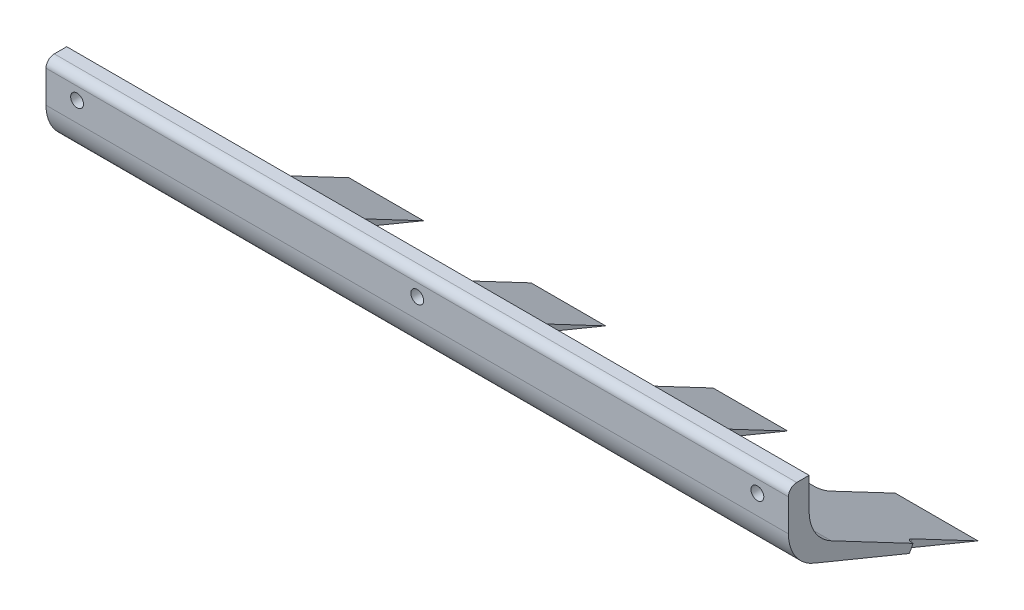
ISO-10303-21;
HEADER;
FILE_DESCRIPTION(('STEP AP214'),'2;1');
FILE_NAME('part.step','',(''),(''),'','','');
FILE_SCHEMA(('AUTOMOTIVE_DESIGN { 1 0 10303 214 1 1 1 1 }'));
ENDSEC;
DATA;
#1=APPLICATION_CONTEXT('core data for automotive mechanical design processes');
#2=APPLICATION_PROTOCOL_DEFINITION('international standard','automotive_design',2000,#1);
#3=PRODUCT_CONTEXT('',#1,'mechanical');
#4=PRODUCT('Part','Part','',(#3));
#5=PRODUCT_RELATED_PRODUCT_CATEGORY('part','',(#4));
#6=PRODUCT_DEFINITION_FORMATION('','',#4);
#7=PRODUCT_DEFINITION_CONTEXT('part definition',#1,'design');
#8=PRODUCT_DEFINITION('design','',#6,#7);
#9=PRODUCT_DEFINITION_SHAPE('','',#8);
#10=(LENGTH_UNIT() NAMED_UNIT(*) SI_UNIT(.MILLI.,.METRE.));
#11=(NAMED_UNIT(*) PLANE_ANGLE_UNIT() SI_UNIT($,.RADIAN.));
#12=(NAMED_UNIT(*) SI_UNIT($,.STERADIAN.) SOLID_ANGLE_UNIT());
#13=UNCERTAINTY_MEASURE_WITH_UNIT(LENGTH_MEASURE(1.E-05),#10,'distance_accuracy_value','');
#14=(GEOMETRIC_REPRESENTATION_CONTEXT(3) GLOBAL_UNCERTAINTY_ASSIGNED_CONTEXT((#13)) GLOBAL_UNIT_ASSIGNED_CONTEXT((#10,
#11,#12)) REPRESENTATION_CONTEXT('',''));
#15=CARTESIAN_POINT('',(0.,0.,0.));
#16=DIRECTION('',(0.,0.,1.));
#17=DIRECTION('',(1.,0.,0.));
#18=AXIS2_PLACEMENT_3D('',#15,#16,#17);
#19=CARTESIAN_POINT('',(179.4,-15.4886358457732,2.5));
#20=DIRECTION('',(0.,-1.,0.));
#21=DIRECTION('',(0.,0.,-1.));
#22=AXIS2_PLACEMENT_3D('',#19,#20,#21);
#23=PLANE('',#22);
#24=DIRECTION('',(0.,0.,1.));
#25=VECTOR('',#24,1.);
#26=CARTESIAN_POINT('',(0.,-15.4886358457732,2.5));
#27=LINE('',#26,#25);
#28=CARTESIAN_POINT('',(0.,-15.4886358457732,-2.5));
#29=VERTEX_POINT('',#28);
#30=CARTESIAN_POINT('',(0.,-15.4886358457732,0.499999999999997));
#31=VERTEX_POINT('',#30);
#32=EDGE_CURVE('E285',#29,#31,#27,.T.);
#33=ORIENTED_EDGE('',*,*,#32,.T.);
#34=DIRECTION('',(-1.,0.,0.));
#35=VECTOR('',#34,1.);
#36=CARTESIAN_POINT('',(179.4,-15.4886358457732,0.499999999999997));
#37=LINE('',#36,#35);
#38=CARTESIAN_POINT('',(179.4,-15.4886358457732,0.499999999999997));
#39=VERTEX_POINT('',#38);
#40=EDGE_CURVE('E51',#31,#39,#37,.F.);
#41=ORIENTED_EDGE('',*,*,#40,.T.);
#42=DIRECTION('',(0.,0.,1.));
#43=VECTOR('',#42,1.);
#44=CARTESIAN_POINT('',(179.4,-15.4886358457732,2.5));
#45=LINE('',#44,#43);
#46=CARTESIAN_POINT('',(179.4,-15.4886358457732,-2.5));
#47=VERTEX_POINT('',#46);
#48=EDGE_CURVE('E277',#47,#39,#45,.T.);
#49=ORIENTED_EDGE('',*,*,#48,.F.);
#50=DIRECTION('',(-1.,0.,0.));
#51=VECTOR('',#50,1.);
#52=CARTESIAN_POINT('',(179.4,-15.4886358457732,-2.5));
#53=LINE('',#52,#51);
#54=EDGE_CURVE('E264',#47,#29,#53,.T.);
#55=ORIENTED_EDGE('',*,*,#54,.T.);
#56=EDGE_LOOP('',(#33,#41,#49,#55));
#57=FACE_BOUND('',#56,.T.);
#58=ADVANCED_FACE('F43',(#57),#23,.F.);
#59=CARTESIAN_POINT('',(179.4,-15.4886358457732,2.5));
#60=DIRECTION('',(0.,0.,-1.));
#61=DIRECTION('',(0.,1.,0.));
#62=AXIS2_PLACEMENT_3D('',#59,#60,#61);
#63=PLANE('',#62);
#64=CARTESIAN_POINT('',(171.9,-20.4886358457732,2.5));
#65=DIRECTION('',(0.,0.,-1.));
#66=DIRECTION('',(0.,1.,0.));
#67=AXIS2_PLACEMENT_3D('',#64,#65,#66);
#68=CIRCLE('',#67,1.54999999999999);
#69=CARTESIAN_POINT('',(171.9,-18.9386358457732,2.5));
#70=VERTEX_POINT('',#69);
#71=EDGE_CURVE('E286',#70,#70,#68,.F.);
#72=ORIENTED_EDGE('',*,*,#71,.F.);
#73=EDGE_LOOP('',(#72));
#74=FACE_BOUND('',#73,.T.);
#75=CARTESIAN_POINT('',(7.50000000000001,-20.4886358457732,2.5));
#76=DIRECTION('',(0.,0.,-1.));
#77=DIRECTION('',(0.,1.,0.));
#78=AXIS2_PLACEMENT_3D('',#75,#76,#77);
#79=CIRCLE('',#78,1.54999999999999);
#80=CARTESIAN_POINT('',(7.50000000000001,-18.9386358457732,2.5));
#81=VERTEX_POINT('',#80);
#82=EDGE_CURVE('E298',#81,#81,#79,.F.);
#83=ORIENTED_EDGE('',*,*,#82,.F.);
#84=EDGE_LOOP('',(#83));
#85=FACE_BOUND('',#84,.T.);
#86=CARTESIAN_POINT('',(89.7,-20.4886358457732,2.5));
#87=DIRECTION('',(0.,0.,-1.));
#88=DIRECTION('',(0.,1.,0.));
#89=AXIS2_PLACEMENT_3D('',#86,#87,#88);
#90=CIRCLE('',#89,1.54999999999999);
#91=CARTESIAN_POINT('',(89.7,-18.9386358457732,2.5));
#92=VERTEX_POINT('',#91);
#93=EDGE_CURVE('E299',#92,#92,#90,.F.);
#94=ORIENTED_EDGE('',*,*,#93,.F.);
#95=EDGE_LOOP('',(#94));
#96=FACE_BOUND('',#95,.T.);
#97=DIRECTION('',(0.,-1.,0.));
#98=VECTOR('',#97,1.);
#99=CARTESIAN_POINT('',(179.4,-15.4886358457732,2.5));
#100=LINE('',#99,#98);
#101=CARTESIAN_POINT('',(179.4,-17.4886358457732,2.5));
#102=VERTEX_POINT('',#101);
#103=CARTESIAN_POINT('',(179.4,-25.2349350396009,2.5));
#104=VERTEX_POINT('',#103);
#105=EDGE_CURVE('E292',#102,#104,#100,.T.);
#106=ORIENTED_EDGE('',*,*,#105,.F.);
#107=DIRECTION('',(-1.,0.,0.));
#108=VECTOR('',#107,1.);
#109=CARTESIAN_POINT('',(179.4,-17.4886358457732,2.5));
#110=LINE('',#109,#108);
#111=CARTESIAN_POINT('',(0.,-17.4886358457732,2.5));
#112=VERTEX_POINT('',#111);
#113=EDGE_CURVE('E461',#102,#112,#110,.T.);
#114=ORIENTED_EDGE('',*,*,#113,.T.);
#115=DIRECTION('',(0.,-1.,0.));
#116=VECTOR('',#115,1.);
#117=CARTESIAN_POINT('',(0.,-15.4886358457732,2.5));
#118=LINE('',#117,#116);
#119=CARTESIAN_POINT('',(0.,-25.2349350396009,2.5));
#120=VERTEX_POINT('',#119);
#121=EDGE_CURVE('E283',#112,#120,#118,.T.);
#122=ORIENTED_EDGE('',*,*,#121,.T.);
#123=DIRECTION('',(-1.,0.,0.));
#124=VECTOR('',#123,1.);
#125=CARTESIAN_POINT('',(179.4,-25.2349350396009,2.5));
#126=LINE('',#125,#124);
#127=EDGE_CURVE('E478',#120,#104,#126,.F.);
#128=ORIENTED_EDGE('',*,*,#127,.T.);
#129=EDGE_LOOP('',(#106,#114,#122,#128));
#130=FACE_BOUND('',#129,.T.);
#131=ADVANCED_FACE('F467',(#74,#85,#96,#130),#63,.F.);
#132=CARTESIAN_POINT('',(179.4,-31.9320115187472,2.49999999999999));
#133=DIRECTION('',(0.,0.924685943939806,-0.380730751424349));
#134=DIRECTION('',(0.,0.38073075142435,0.924685943939806));
#135=AXIS2_PLACEMENT_3D('',#132,#133,#134);
#136=PLANE('',#135);
#137=DIRECTION('',(-1.,0.,0.));
#138=VECTOR('',#137,1.);
#139=CARTESIAN_POINT('',(25.4000000000001,-43.9707193209763,-26.7385730500459));
#140=LINE('',#139,#138);
#141=CARTESIAN_POINT('',(23.4000000000001,-43.9707193209763,-26.7385730500459));
#142=VERTEX_POINT('',#141);
#143=CARTESIAN_POINT('',(0.,-43.9707193209763,-26.7385730500459));
#144=VERTEX_POINT('',#143);
#145=EDGE_CURVE('E325',#142,#144,#140,.T.);
#146=ORIENTED_EDGE('',*,*,#145,.F.);
#147=CARTESIAN_POINT('',(23.4000000000001,-44.7356022821595,-28.5962546802245));
#148=DIRECTION('',(0.,0.924685943939806,-0.380730751424349));
#149=DIRECTION('',(0.,0.380730751424349,0.924685943939806));
#150=AXIS2_PLACEMENT_3D('',#147,#148,#149);
#151=ELLIPSE('',#150,2.00898655630435,2.);
#152=CARTESIAN_POINT('',(25.4000000000001,-44.7356022821595,-28.5962546802245));
#153=VERTEX_POINT('',#152);
#154=EDGE_CURVE('E432',#142,#153,#151,.T.);
#155=ORIENTED_EDGE('',*,*,#154,.T.);
#156=DIRECTION('',(0.,0.38073075142435,0.924685943939806));
#157=VECTOR('',#156,1.);
#158=CARTESIAN_POINT('',(25.4000000000001,-50.8173179704012,-43.3670001241284));
#159=LINE('',#158,#157);
#160=CARTESIAN_POINT('',(25.4000000000001,-51.619548932808,-45.3153893518326));
#161=VERTEX_POINT('',#160);
#162=EDGE_CURVE('E328',#161,#153,#159,.T.);
#163=ORIENTED_EDGE('',*,*,#162,.F.);
#164=DIRECTION('',(-1.,0.,0.));
#165=VECTOR('',#164,1.);
#166=CARTESIAN_POINT('',(179.4,-51.619548932808,-45.3153893518326));
#167=LINE('',#166,#165);
#168=CARTESIAN_POINT('',(43.4000000000001,-51.619548932808,-45.3153893518326));
#169=VERTEX_POINT('',#168);
#170=EDGE_CURVE('E257',#169,#161,#167,.T.);
#171=ORIENTED_EDGE('',*,*,#170,.F.);
#172=DIRECTION('',(0.,-0.38073075142435,-0.924685943939806));
#173=VECTOR('',#172,1.);
#174=CARTESIAN_POINT('',(43.4,-50.8173179704012,-43.3670001241285));
#175=LINE('',#174,#173);
#176=CARTESIAN_POINT('',(43.4000000000001,-44.7356022821595,-28.5962546802246));
#177=VERTEX_POINT('',#176);
#178=EDGE_CURVE('E338',#177,#169,#175,.T.);
#179=ORIENTED_EDGE('',*,*,#178,.F.);
#180=CARTESIAN_POINT('',(45.4,-44.7356022821595,-28.5962546802246));
#181=DIRECTION('',(0.,0.924685943939806,-0.380730751424349));
#182=DIRECTION('',(0.,0.380730751424349,0.924685943939806));
#183=AXIS2_PLACEMENT_3D('',#180,#181,#182);
#184=ELLIPSE('',#183,2.00898655630435,2.);
#185=CARTESIAN_POINT('',(45.4,-43.9707193209763,-26.7385730500459));
#186=VERTEX_POINT('',#185);
#187=EDGE_CURVE('E436',#177,#186,#184,.T.);
#188=ORIENTED_EDGE('',*,*,#187,.T.);
#189=DIRECTION('',(-1.,0.,0.));
#190=VECTOR('',#189,1.);
#191=CARTESIAN_POINT('',(69.4000000000001,-43.9707193209763,-26.7385730500459));
#192=LINE('',#191,#190);
#193=CARTESIAN_POINT('',(67.4000000000001,-43.9707193209763,-26.7385730500459));
#194=VERTEX_POINT('',#193);
#195=EDGE_CURVE('E341',#194,#186,#192,.T.);
#196=ORIENTED_EDGE('',*,*,#195,.F.);
#197=CARTESIAN_POINT('',(67.4000000000001,-44.7356022821595,-28.5962546802245));
#198=DIRECTION('',(0.,0.924685943939806,-0.380730751424349));
#199=DIRECTION('',(0.,0.380730751424349,0.924685943939806));
#200=AXIS2_PLACEMENT_3D('',#197,#198,#199);
#201=ELLIPSE('',#200,2.00898655630435,2.);
#202=CARTESIAN_POINT('',(69.4000000000001,-44.7356022821595,-28.5962546802245));
#203=VERTEX_POINT('',#202);
#204=EDGE_CURVE('E440',#194,#203,#201,.T.);
#205=ORIENTED_EDGE('',*,*,#204,.T.);
#206=DIRECTION('',(0.,0.38073075142435,0.924685943939806));
#207=VECTOR('',#206,1.);
#208=CARTESIAN_POINT('',(69.4000000000001,-50.8173179704012,-43.3670001241285));
#209=LINE('',#208,#207);
#210=CARTESIAN_POINT('',(69.4000000000001,-51.619548932808,-45.3153893518326));
#211=VERTEX_POINT('',#210);
#212=EDGE_CURVE('E344',#211,#203,#209,.T.);
#213=ORIENTED_EDGE('',*,*,#212,.F.);
#214=CARTESIAN_POINT('',(87.4000000000001,-51.619548932808,-45.3153893518326));
#215=VERTEX_POINT('',#214);
#216=EDGE_CURVE('E262',#215,#211,#167,.T.);
#217=ORIENTED_EDGE('',*,*,#216,.F.);
#218=DIRECTION('',(0.,-0.38073075142435,-0.924685943939806));
#219=VECTOR('',#218,1.);
#220=CARTESIAN_POINT('',(87.4000000000001,-50.8173179704012,-43.3670001241284));
#221=LINE('',#220,#219);
#222=CARTESIAN_POINT('',(87.4000000000001,-44.7356022821595,-28.5962546802246));
#223=VERTEX_POINT('',#222);
#224=EDGE_CURVE('E354',#223,#215,#221,.T.);
#225=ORIENTED_EDGE('',*,*,#224,.F.);
#226=CARTESIAN_POINT('',(89.4000000000001,-44.7356022821595,-28.5962546802246));
#227=DIRECTION('',(0.,0.924685943939806,-0.380730751424349));
#228=DIRECTION('',(0.,0.380730751424349,0.924685943939806));
#229=AXIS2_PLACEMENT_3D('',#226,#227,#228);
#230=ELLIPSE('',#229,2.00898655630435,2.);
#231=CARTESIAN_POINT('',(89.4000000000001,-43.9707193209763,-26.7385730500459));
#232=VERTEX_POINT('',#231);
#233=EDGE_CURVE('E444',#223,#232,#230,.T.);
#234=ORIENTED_EDGE('',*,*,#233,.T.);
#235=DIRECTION('',(-1.,0.,0.));
#236=VECTOR('',#235,1.);
#237=CARTESIAN_POINT('',(113.4,-43.9707193209763,-26.7385730500459));
#238=LINE('',#237,#236);
#239=CARTESIAN_POINT('',(111.4,-43.9707193209763,-26.7385730500459));
#240=VERTEX_POINT('',#239);
#241=EDGE_CURVE('E356',#240,#232,#238,.T.);
#242=ORIENTED_EDGE('',*,*,#241,.F.);
#243=CARTESIAN_POINT('',(111.4,-44.7356022821595,-28.5962546802246));
#244=DIRECTION('',(0.,0.924685943939806,-0.380730751424349));
#245=DIRECTION('',(0.,0.380730751424349,0.924685943939806));
#246=AXIS2_PLACEMENT_3D('',#243,#244,#245);
#247=ELLIPSE('',#246,2.00898655630435,2.);
#248=CARTESIAN_POINT('',(113.4,-44.7356022821595,-28.5962546802246));
#249=VERTEX_POINT('',#248);
#250=EDGE_CURVE('E448',#240,#249,#247,.T.);
#251=ORIENTED_EDGE('',*,*,#250,.T.);
#252=DIRECTION('',(0.,0.38073075142435,0.924685943939806));
#253=VECTOR('',#252,1.);
#254=CARTESIAN_POINT('',(113.4,-50.8173179704012,-43.3670001241284));
#255=LINE('',#254,#253);
#256=CARTESIAN_POINT('',(113.4,-51.619548932808,-45.3153893518326));
#257=VERTEX_POINT('',#256);
#258=EDGE_CURVE('E359',#257,#249,#255,.T.);
#259=ORIENTED_EDGE('',*,*,#258,.F.);
#260=CARTESIAN_POINT('',(131.4,-51.619548932808,-45.3153893518326));
#261=VERTEX_POINT('',#260);
#262=EDGE_CURVE('E255',#261,#257,#167,.T.);
#263=ORIENTED_EDGE('',*,*,#262,.F.);
#264=DIRECTION('',(0.,-0.38073075142435,-0.924685943939806));
#265=VECTOR('',#264,1.);
#266=CARTESIAN_POINT('',(131.4,-50.8173179704012,-43.3670001241284));
#267=LINE('',#266,#265);
#268=CARTESIAN_POINT('',(131.4,-44.7356022821595,-28.5962546802245));
#269=VERTEX_POINT('',#268);
#270=EDGE_CURVE('E237',#269,#261,#267,.T.);
#271=ORIENTED_EDGE('',*,*,#270,.F.);
#272=CARTESIAN_POINT('',(133.4,-44.7356022821595,-28.5962546802245));
#273=DIRECTION('',(0.,0.924685943939806,-0.380730751424349));
#274=DIRECTION('',(0.,0.380730751424349,0.924685943939806));
#275=AXIS2_PLACEMENT_3D('',#272,#273,#274);
#276=ELLIPSE('',#275,2.00898655630435,2.);
#277=CARTESIAN_POINT('',(133.4,-43.9707193209763,-26.7385730500459));
#278=VERTEX_POINT('',#277);
#279=EDGE_CURVE('E455',#269,#278,#276,.T.);
#280=ORIENTED_EDGE('',*,*,#279,.T.);
#281=DIRECTION('',(-1.,0.,0.));
#282=VECTOR('',#281,1.);
#283=CARTESIAN_POINT('',(157.4,-43.9707193209763,-26.7385730500459));
#284=LINE('',#283,#282);
#285=CARTESIAN_POINT('',(155.4,-43.9707193209763,-26.7385730500459));
#286=VERTEX_POINT('',#285);
#287=EDGE_CURVE('E321',#286,#278,#284,.T.);
#288=ORIENTED_EDGE('',*,*,#287,.F.);
#289=CARTESIAN_POINT('',(155.4,-44.7356022821595,-28.5962546802245));
#290=DIRECTION('',(0.,0.924685943939806,-0.380730751424349));
#291=DIRECTION('',(0.,0.380730751424349,0.924685943939806));
#292=AXIS2_PLACEMENT_3D('',#289,#290,#291);
#293=ELLIPSE('',#292,2.00898655630435,2.);
#294=CARTESIAN_POINT('',(157.4,-44.7356022821595,-28.5962546802245));
#295=VERTEX_POINT('',#294);
#296=EDGE_CURVE('E459',#286,#295,#293,.T.);
#297=ORIENTED_EDGE('',*,*,#296,.T.);
#298=DIRECTION('',(0.,0.38073075142435,0.924685943939806));
#299=VECTOR('',#298,1.);
#300=CARTESIAN_POINT('',(157.4,-50.8173179704012,-43.3670001241284));
#301=LINE('',#300,#299);
#302=CARTESIAN_POINT('',(157.4,-51.619548932808,-45.3153893518326));
#303=VERTEX_POINT('',#302);
#304=EDGE_CURVE('E253',#303,#295,#301,.T.);
#305=ORIENTED_EDGE('',*,*,#304,.F.);
#306=CARTESIAN_POINT('',(177.4,-51.6195489328081,-45.3153893518326));
#307=VERTEX_POINT('',#306);
#308=EDGE_CURVE('E244',#307,#303,#167,.T.);
#309=ORIENTED_EDGE('',*,*,#308,.F.);
#310=DIRECTION('',(0.,-0.38073075142435,-0.924685943939806));
#311=VECTOR('',#310,1.);
#312=CARTESIAN_POINT('',(177.4,-50.8173179704012,-43.3670001241285));
#313=LINE('',#312,#311);
#314=CARTESIAN_POINT('',(177.4,-44.7356022821595,-28.5962546802246));
#315=VERTEX_POINT('',#314);
#316=EDGE_CURVE('E228',#315,#307,#313,.T.);
#317=ORIENTED_EDGE('',*,*,#316,.F.);
#318=CARTESIAN_POINT('',(179.4,-44.7356022821595,-28.5962546802246));
#319=DIRECTION('',(0.,0.924685943939806,-0.380730751424349));
#320=DIRECTION('',(0.,0.380730751424349,0.924685943939806));
#321=AXIS2_PLACEMENT_3D('',#318,#319,#320);
#322=ELLIPSE('',#321,2.00898655630435,2.);
#323=CARTESIAN_POINT('',(179.4,-43.9707193209763,-26.7385730500459));
#324=VERTEX_POINT('',#323);
#325=EDGE_CURVE('E451',#315,#324,#322,.T.);
#326=ORIENTED_EDGE('',*,*,#325,.T.);
#327=DIRECTION('',(0.,-0.38073075142435,-0.924685943939806));
#328=VECTOR('',#327,1.);
#329=CARTESIAN_POINT('',(179.4,-31.9320115187472,2.49999999999999));
#330=LINE('',#329,#328);
#331=CARTESIAN_POINT('',(179.4,-34.481794478999,-3.69269248575651));
#332=VERTEX_POINT('',#331);
#333=EDGE_CURVE('E289',#332,#324,#330,.T.);
#334=ORIENTED_EDGE('',*,*,#333,.F.);
#335=DIRECTION('',(-1.,0.,0.));
#336=VECTOR('',#335,1.);
#337=CARTESIAN_POINT('',(179.4,-34.481794478999,-3.69269248575651));
#338=LINE('',#337,#336);
#339=CARTESIAN_POINT('',(0.,-34.481794478999,-3.69269248575651));
#340=VERTEX_POINT('',#339);
#341=EDGE_CURVE('E254',#332,#340,#338,.T.);
#342=ORIENTED_EDGE('',*,*,#341,.T.);
#343=DIRECTION('',(0.,-0.38073075142435,-0.924685943939806));
#344=VECTOR('',#343,1.);
#345=CARTESIAN_POINT('',(0.,-31.9320115187472,2.49999999999999));
#346=LINE('',#345,#344);
#347=EDGE_CURVE('E280',#340,#144,#346,.T.);
#348=ORIENTED_EDGE('',*,*,#347,.T.);
#349=EDGE_LOOP('',(#146,#155,#163,#171,#179,#188,#196,#205,#213,#217,#225,#234,#242,#251,#259,
#263,#271,#280,#288,#297,#305,#309,#317,#326,#334,#342,#348));
#350=FACE_BOUND('',#349,.T.);
#351=ADVANCED_FACE('F251',(#350),#136,.F.);
#352=CARTESIAN_POINT('',(179.4,-29.0452601727991,-2.5));
#353=DIRECTION('',(0.,-0.884578462490672,0.466391406114691));
#354=DIRECTION('',(0.,-0.466391406114691,-0.884578462490672));
#355=AXIS2_PLACEMENT_3D('',#352,#353,#354);
#356=PLANE('',#355);
#357=ORIENTED_EDGE('',*,*,#170,.T.);
#358=DIRECTION('',(0.,-0.466391406114691,-0.884578462490672));
#359=VECTOR('',#358,1.);
#360=CARTESIAN_POINT('',(25.4000000000001,-51.619548932808,-45.3153893518326));
#361=LINE('',#360,#359);
#362=CARTESIAN_POINT('',(25.4000000000001,-43.2245036227436,-29.3929770270004));
#363=VERTEX_POINT('',#362);
#364=EDGE_CURVE('E334',#363,#161,#361,.T.);
#365=ORIENTED_EDGE('',*,*,#364,.F.);
#366=CARTESIAN_POINT('',(23.4000000000001,-43.2245036227436,-29.3929770270004));
#367=DIRECTION('',(0.,-0.884578462490672,0.466391406114691));
#368=DIRECTION('',(0.,-0.466391406114691,-0.884578462490672));
#369=AXIS2_PLACEMENT_3D('',#366,#367,#368);
#370=CIRCLE('',#369,2.);
#371=CARTESIAN_POINT('',(23.4000000000001,-42.2917208105142,-27.6238201020191));
#372=VERTEX_POINT('',#371);
#373=EDGE_CURVE('E430',#363,#372,#370,.T.);
#374=ORIENTED_EDGE('',*,*,#373,.T.);
#375=DIRECTION('',(1.,0.,0.));
#376=VECTOR('',#375,1.);
#377=CARTESIAN_POINT('',(25.4000000000001,-42.2917208105142,-27.6238201020191));
#378=LINE('',#377,#376);
#379=CARTESIAN_POINT('',(0.,-42.2917208105142,-27.6238201020191));
#380=VERTEX_POINT('',#379);
#381=EDGE_CURVE('E331',#380,#372,#378,.T.);
#382=ORIENTED_EDGE('',*,*,#381,.F.);
#383=DIRECTION('',(0.,0.466391406114691,0.884578462490672));
#384=VECTOR('',#383,1.);
#385=CARTESIAN_POINT('',(0.,-29.0452601727991,-2.5));
#386=LINE('',#385,#384);
#387=CARTESIAN_POINT('',(0.,-31.8586958709317,-7.83608593885309));
#388=VERTEX_POINT('',#387);
#389=EDGE_CURVE('E278',#380,#388,#386,.T.);
#390=ORIENTED_EDGE('',*,*,#389,.T.);
#391=DIRECTION('',(-1.,0.,0.));
#392=VECTOR('',#391,1.);
#393=CARTESIAN_POINT('',(179.4,-31.8586958709317,-7.83608593885309));
#394=LINE('',#393,#392);
#395=CARTESIAN_POINT('',(179.4,-31.8586958709317,-7.83608593885309));
#396=VERTEX_POINT('',#395);
#397=EDGE_CURVE('E377',#388,#396,#394,.F.);
#398=ORIENTED_EDGE('',*,*,#397,.T.);
#399=DIRECTION('',(0.,0.466391406114691,0.884578462490672));
#400=VECTOR('',#399,1.);
#401=CARTESIAN_POINT('',(179.4,-29.0452601727991,-2.5));
#402=LINE('',#401,#400);
#403=CARTESIAN_POINT('',(179.4,-42.2917208105142,-27.6238201020191));
#404=VERTEX_POINT('',#403);
#405=EDGE_CURVE('E272',#404,#396,#402,.T.);
#406=ORIENTED_EDGE('',*,*,#405,.F.);
#407=CARTESIAN_POINT('',(179.4,-43.2245036227436,-29.3929770270005));
#408=DIRECTION('',(0.,-0.884578462490672,0.466391406114691));
#409=DIRECTION('',(0.,-0.466391406114691,-0.884578462490672));
#410=AXIS2_PLACEMENT_3D('',#407,#408,#409);
#411=CIRCLE('',#410,2.);
#412=CARTESIAN_POINT('',(177.4,-43.2245036227436,-29.3929770270005));
#413=VERTEX_POINT('',#412);
#414=EDGE_CURVE('E246',#404,#413,#411,.T.);
#415=ORIENTED_EDGE('',*,*,#414,.T.);
#416=DIRECTION('',(0.,0.466391406114691,0.884578462490672));
#417=VECTOR('',#416,1.);
#418=CARTESIAN_POINT('',(177.4,-51.6195489328081,-45.3153893518326));
#419=LINE('',#418,#417);
#420=EDGE_CURVE('E231',#307,#413,#419,.T.);
#421=ORIENTED_EDGE('',*,*,#420,.F.);
#422=ORIENTED_EDGE('',*,*,#308,.T.);
#423=DIRECTION('',(0.,-0.466391406114691,-0.884578462490672));
#424=VECTOR('',#423,1.);
#425=CARTESIAN_POINT('',(157.4,-51.619548932808,-45.3153893518326));
#426=LINE('',#425,#424);
#427=CARTESIAN_POINT('',(157.4,-43.2245036227436,-29.3929770270005));
#428=VERTEX_POINT('',#427);
#429=EDGE_CURVE('E318',#428,#303,#426,.T.);
#430=ORIENTED_EDGE('',*,*,#429,.F.);
#431=CARTESIAN_POINT('',(155.4,-43.2245036227436,-29.3929770270005));
#432=DIRECTION('',(0.,-0.884578462490672,0.466391406114691));
#433=DIRECTION('',(0.,-0.466391406114691,-0.884578462490672));
#434=AXIS2_PLACEMENT_3D('',#431,#432,#433);
#435=CIRCLE('',#434,2.);
#436=CARTESIAN_POINT('',(155.4,-42.2917208105142,-27.6238201020191));
#437=VERTEX_POINT('',#436);
#438=EDGE_CURVE('E457',#428,#437,#435,.T.);
#439=ORIENTED_EDGE('',*,*,#438,.T.);
#440=DIRECTION('',(1.,0.,0.));
#441=VECTOR('',#440,1.);
#442=CARTESIAN_POINT('',(157.4,-42.2917208105142,-27.6238201020191));
#443=LINE('',#442,#441);
#444=CARTESIAN_POINT('',(133.4,-42.2917208105142,-27.6238201020191));
#445=VERTEX_POINT('',#444);
#446=EDGE_CURVE('E302',#445,#437,#443,.T.);
#447=ORIENTED_EDGE('',*,*,#446,.F.);
#448=CARTESIAN_POINT('',(133.4,-43.2245036227436,-29.3929770270005));
#449=DIRECTION('',(0.,-0.884578462490672,0.466391406114691));
#450=DIRECTION('',(0.,-0.466391406114691,-0.884578462490672));
#451=AXIS2_PLACEMENT_3D('',#448,#449,#450);
#452=CIRCLE('',#451,2.);
#453=CARTESIAN_POINT('',(131.4,-43.2245036227436,-29.3929770270005));
#454=VERTEX_POINT('',#453);
#455=EDGE_CURVE('E453',#445,#454,#452,.T.);
#456=ORIENTED_EDGE('',*,*,#455,.T.);
#457=DIRECTION('',(0.,0.466391406114691,0.884578462490672));
#458=VECTOR('',#457,1.);
#459=CARTESIAN_POINT('',(131.4,-51.619548932808,-45.3153893518326));
#460=LINE('',#459,#458);
#461=EDGE_CURVE('E315',#261,#454,#460,.T.);
#462=ORIENTED_EDGE('',*,*,#461,.F.);
#463=ORIENTED_EDGE('',*,*,#262,.T.);
#464=DIRECTION('',(0.,-0.466391406114691,-0.884578462490672));
#465=VECTOR('',#464,1.);
#466=CARTESIAN_POINT('',(113.4,-51.619548932808,-45.3153893518326));
#467=LINE('',#466,#465);
#468=CARTESIAN_POINT('',(113.4,-43.2245036227436,-29.3929770270005));
#469=VERTEX_POINT('',#468);
#470=EDGE_CURVE('E340',#469,#257,#467,.T.);
#471=ORIENTED_EDGE('',*,*,#470,.F.);
#472=CARTESIAN_POINT('',(111.4,-43.2245036227436,-29.3929770270005));
#473=DIRECTION('',(0.,-0.884578462490672,0.466391406114691));
#474=DIRECTION('',(0.,-0.466391406114691,-0.884578462490672));
#475=AXIS2_PLACEMENT_3D('',#472,#473,#474);
#476=CIRCLE('',#475,2.);
#477=CARTESIAN_POINT('',(111.4,-42.2917208105142,-27.6238201020191));
#478=VERTEX_POINT('',#477);
#479=EDGE_CURVE('E446',#469,#478,#476,.T.);
#480=ORIENTED_EDGE('',*,*,#479,.T.);
#481=DIRECTION('',(1.,0.,0.));
#482=VECTOR('',#481,1.);
#483=CARTESIAN_POINT('',(113.4,-42.2917208105142,-27.6238201020191));
#484=LINE('',#483,#482);
#485=CARTESIAN_POINT('',(89.4000000000001,-42.2917208105142,-27.6238201020191));
#486=VERTEX_POINT('',#485);
#487=EDGE_CURVE('E365',#486,#478,#484,.T.);
#488=ORIENTED_EDGE('',*,*,#487,.F.);
#489=CARTESIAN_POINT('',(89.4000000000001,-43.2245036227436,-29.3929770270005));
#490=DIRECTION('',(0.,-0.884578462490672,0.466391406114691));
#491=DIRECTION('',(0.,-0.466391406114691,-0.884578462490672));
#492=AXIS2_PLACEMENT_3D('',#489,#490,#491);
#493=CIRCLE('',#492,2.);
#494=CARTESIAN_POINT('',(87.4000000000001,-43.2245036227436,-29.3929770270005));
#495=VERTEX_POINT('',#494);
#496=EDGE_CURVE('E442',#486,#495,#493,.T.);
#497=ORIENTED_EDGE('',*,*,#496,.T.);
#498=DIRECTION('',(0.,0.466391406114691,0.884578462490672));
#499=VECTOR('',#498,1.);
#500=CARTESIAN_POINT('',(87.4000000000001,-51.619548932808,-45.3153893518326));
#501=LINE('',#500,#499);
#502=EDGE_CURVE('E362',#215,#495,#501,.T.);
#503=ORIENTED_EDGE('',*,*,#502,.F.);
#504=ORIENTED_EDGE('',*,*,#216,.T.);
#505=DIRECTION('',(0.,-0.466391406114691,-0.884578462490672));
#506=VECTOR('',#505,1.);
#507=CARTESIAN_POINT('',(69.4000000000001,-51.619548932808,-45.3153893518326));
#508=LINE('',#507,#506);
#509=CARTESIAN_POINT('',(69.4000000000001,-43.2245036227436,-29.3929770270005));
#510=VERTEX_POINT('',#509);
#511=EDGE_CURVE('E327',#510,#211,#508,.T.);
#512=ORIENTED_EDGE('',*,*,#511,.F.);
#513=CARTESIAN_POINT('',(67.4000000000001,-43.2245036227436,-29.3929770270005));
#514=DIRECTION('',(0.,-0.884578462490672,0.466391406114691));
#515=DIRECTION('',(0.,-0.466391406114691,-0.884578462490672));
#516=AXIS2_PLACEMENT_3D('',#513,#514,#515);
#517=CIRCLE('',#516,2.);
#518=CARTESIAN_POINT('',(67.4000000000001,-42.2917208105142,-27.6238201020191));
#519=VERTEX_POINT('',#518);
#520=EDGE_CURVE('E438',#510,#519,#517,.T.);
#521=ORIENTED_EDGE('',*,*,#520,.T.);
#522=DIRECTION('',(1.,0.,0.));
#523=VECTOR('',#522,1.);
#524=CARTESIAN_POINT('',(69.4000000000001,-42.2917208105142,-27.6238201020191));
#525=LINE('',#524,#523);
#526=CARTESIAN_POINT('',(45.4,-42.2917208105142,-27.6238201020191));
#527=VERTEX_POINT('',#526);
#528=EDGE_CURVE('E350',#527,#519,#525,.T.);
#529=ORIENTED_EDGE('',*,*,#528,.F.);
#530=CARTESIAN_POINT('',(45.4,-43.2245036227436,-29.3929770270005));
#531=DIRECTION('',(0.,-0.884578462490672,0.466391406114691));
#532=DIRECTION('',(0.,-0.466391406114691,-0.884578462490672));
#533=AXIS2_PLACEMENT_3D('',#530,#531,#532);
#534=CIRCLE('',#533,2.);
#535=CARTESIAN_POINT('',(43.4000000000001,-43.2245036227436,-29.3929770270005));
#536=VERTEX_POINT('',#535);
#537=EDGE_CURVE('E434',#527,#536,#534,.T.);
#538=ORIENTED_EDGE('',*,*,#537,.T.);
#539=DIRECTION('',(0.,0.466391406114691,0.884578462490672));
#540=VECTOR('',#539,1.);
#541=CARTESIAN_POINT('',(43.4,-51.619548932808,-45.3153893518326));
#542=LINE('',#541,#540);
#543=EDGE_CURVE('E347',#169,#536,#542,.T.);
#544=ORIENTED_EDGE('',*,*,#543,.F.);
#545=EDGE_LOOP('',(#357,#365,#374,#382,#390,#398,#406,#415,#421,#422,#430,#439,#447,#456,#462,
#463,#471,#480,#488,#497,#503,#504,#512,#521,#529,#538,#544));
#546=FACE_BOUND('',#545,.T.);
#547=ADVANCED_FACE('F242',(#546),#356,.F.);
#548=CARTESIAN_POINT('',(179.4,-15.4886358457732,-2.5));
#549=DIRECTION('',(0.,0.,1.));
#550=DIRECTION('',(0.,-1.,0.));
#551=AXIS2_PLACEMENT_3D('',#548,#549,#550);
#552=PLANE('',#551);
#553=CARTESIAN_POINT('',(171.9,-20.4886358457732,-2.5));
#554=DIRECTION('',(0.,0.,-1.));
#555=DIRECTION('',(0.,1.,0.));
#556=AXIS2_PLACEMENT_3D('',#553,#554,#555);
#557=CIRCLE('',#556,1.54999999999999);
#558=CARTESIAN_POINT('',(171.9,-18.9386358457732,-2.5));
#559=VERTEX_POINT('',#558);
#560=EDGE_CURVE('E306',#559,#559,#557,.T.);
#561=ORIENTED_EDGE('',*,*,#560,.F.);
#562=EDGE_LOOP('',(#561));
#563=FACE_BOUND('',#562,.T.);
#564=CARTESIAN_POINT('',(7.50000000000001,-20.4886358457732,-2.5));
#565=DIRECTION('',(0.,0.,-1.));
#566=DIRECTION('',(0.,-1.,0.));
#567=AXIS2_PLACEMENT_3D('',#564,#565,#566);
#568=CIRCLE('',#567,1.54999999999999);
#569=CARTESIAN_POINT('',(7.50000000000001,-22.0386358457732,-2.5));
#570=VERTEX_POINT('',#569);
#571=EDGE_CURVE('E303',#570,#570,#568,.T.);
#572=ORIENTED_EDGE('',*,*,#571,.F.);
#573=EDGE_LOOP('',(#572));
#574=FACE_BOUND('',#573,.T.);
#575=CARTESIAN_POINT('',(89.7,-20.4886358457732,-2.5));
#576=DIRECTION('',(0.,0.,-1.));
#577=DIRECTION('',(0.,1.,0.));
#578=AXIS2_PLACEMENT_3D('',#575,#576,#577);
#579=CIRCLE('',#578,1.54999999999999);
#580=CARTESIAN_POINT('',(89.7,-18.9386358457732,-2.5));
#581=VERTEX_POINT('',#580);
#582=EDGE_CURVE('E295',#581,#581,#579,.T.);
#583=ORIENTED_EDGE('',*,*,#582,.F.);
#584=EDGE_LOOP('',(#583));
#585=FACE_BOUND('',#584,.T.);
#586=DIRECTION('',(0.,1.,0.));
#587=VECTOR('',#586,1.);
#588=CARTESIAN_POINT('',(179.4,-15.4886358457732,-2.5));
#589=LINE('',#588,#587);
#590=CARTESIAN_POINT('',(179.4,-23.012911246025,-2.5));
#591=VERTEX_POINT('',#590);
#592=EDGE_CURVE('E270',#591,#47,#589,.T.);
#593=ORIENTED_EDGE('',*,*,#592,.F.);
#594=DIRECTION('',(-1.,0.,0.));
#595=VECTOR('',#594,1.);
#596=CARTESIAN_POINT('',(0.,-23.012911246025,-2.5));
#597=LINE('',#596,#595);
#598=CARTESIAN_POINT('',(0.,-23.012911246025,-2.5));
#599=VERTEX_POINT('',#598);
#600=EDGE_CURVE('E384',#591,#599,#597,.T.);
#601=ORIENTED_EDGE('',*,*,#600,.T.);
#602=DIRECTION('',(0.,1.,0.));
#603=VECTOR('',#602,1.);
#604=CARTESIAN_POINT('',(0.,-15.4886358457732,-2.5));
#605=LINE('',#604,#603);
#606=EDGE_CURVE('E275',#599,#29,#605,.T.);
#607=ORIENTED_EDGE('',*,*,#606,.T.);
#608=ORIENTED_EDGE('',*,*,#54,.F.);
#609=EDGE_LOOP('',(#593,#601,#607,#608));
#610=FACE_BOUND('',#609,.T.);
#611=ADVANCED_FACE('F488',(#563,#574,#585,#610),#552,.F.);
#612=CARTESIAN_POINT('',(179.4,0.,0.));
#613=DIRECTION('',(-1.,0.,0.));
#614=DIRECTION('',(0.,0.,1.));
#615=AXIS2_PLACEMENT_3D('',#612,#613,#614);
#616=PLANE('',#615);
#617=ORIENTED_EDGE('',*,*,#48,.T.);
#618=CARTESIAN_POINT('',(179.4,-17.4886358457732,0.499999999999997));
#619=DIRECTION('',(-1.,0.,0.));
#620=DIRECTION('',(0.,0.,1.));
#621=AXIS2_PLACEMENT_3D('',#618,#619,#620);
#622=CIRCLE('',#621,2.);
#623=EDGE_CURVE('E11',#39,#102,#622,.F.);
#624=ORIENTED_EDGE('',*,*,#623,.T.);
#625=ORIENTED_EDGE('',*,*,#105,.T.);
#626=CARTESIAN_POINT('',(179.4,-25.2349350396009,-7.5));
#627=DIRECTION('',(-1.,0.,0.));
#628=DIRECTION('',(0.,0.,1.));
#629=AXIS2_PLACEMENT_3D('',#626,#627,#628);
#630=CIRCLE('',#629,10.);
#631=EDGE_CURVE('E482',#104,#332,#630,.F.);
#632=ORIENTED_EDGE('',*,*,#631,.T.);
#633=ORIENTED_EDGE('',*,*,#333,.T.);
#634=DIRECTION('',(0.,0.884578462490672,-0.466391406114691));
#635=VECTOR('',#634,1.);
#636=CARTESIAN_POINT('',(179.4,-62.0196229796912,-17.2223414062019));
#637=LINE('',#636,#635);
#638=EDGE_CURVE('E247',#324,#404,#637,.T.);
#639=ORIENTED_EDGE('',*,*,#638,.T.);
#640=ORIENTED_EDGE('',*,*,#405,.T.);
#641=CARTESIAN_POINT('',(179.4,-23.012911246025,-12.5));
#642=DIRECTION('',(-1.,0.,0.));
#643=DIRECTION('',(0.,0.,1.));
#644=AXIS2_PLACEMENT_3D('',#641,#642,#643);
#645=CIRCLE('',#644,10.);
#646=EDGE_CURVE('E387',#396,#591,#645,.T.);
#647=ORIENTED_EDGE('',*,*,#646,.T.);
#648=ORIENTED_EDGE('',*,*,#592,.T.);
#649=EDGE_LOOP('',(#617,#624,#625,#632,#633,#639,#640,#647,#648));
#650=FACE_BOUND('',#649,.T.);
#651=ADVANCED_FACE('F372',(#650),#616,.F.);
#652=CARTESIAN_POINT('',(0.,0.,0.));
#653=DIRECTION('',(-1.,0.,0.));
#654=DIRECTION('',(0.,0.,1.));
#655=AXIS2_PLACEMENT_3D('',#652,#653,#654);
#656=PLANE('',#655);
#657=ORIENTED_EDGE('',*,*,#121,.F.);
#658=CARTESIAN_POINT('',(0.,-17.4886358457732,0.499999999999997));
#659=DIRECTION('',(-1.,0.,0.));
#660=DIRECTION('',(0.,0.,1.));
#661=AXIS2_PLACEMENT_3D('',#658,#659,#660);
#662=CIRCLE('',#661,2.);
#663=EDGE_CURVE('E65',#112,#31,#662,.T.);
#664=ORIENTED_EDGE('',*,*,#663,.T.);
#665=ORIENTED_EDGE('',*,*,#32,.F.);
#666=ORIENTED_EDGE('',*,*,#606,.F.);
#667=CARTESIAN_POINT('',(0.,-23.012911246025,-12.5));
#668=DIRECTION('',(-1.,0.,0.));
#669=DIRECTION('',(0.,0.,1.));
#670=AXIS2_PLACEMENT_3D('',#667,#668,#669);
#671=CIRCLE('',#670,10.);
#672=EDGE_CURVE('E383',#599,#388,#671,.F.);
#673=ORIENTED_EDGE('',*,*,#672,.T.);
#674=ORIENTED_EDGE('',*,*,#389,.F.);
#675=DIRECTION('',(0.,0.884578462490672,-0.466391406114691));
#676=VECTOR('',#675,1.);
#677=CARTESIAN_POINT('',(0.,-62.0196229796912,-17.2223414062018));
#678=LINE('',#677,#676);
#679=EDGE_CURVE('E336',#144,#380,#678,.T.);
#680=ORIENTED_EDGE('',*,*,#679,.F.);
#681=ORIENTED_EDGE('',*,*,#347,.F.);
#682=CARTESIAN_POINT('',(0.,-25.2349350396009,-7.5));
#683=DIRECTION('',(-1.,0.,0.));
#684=DIRECTION('',(0.,0.,1.));
#685=AXIS2_PLACEMENT_3D('',#682,#683,#684);
#686=CIRCLE('',#685,10.);
#687=EDGE_CURVE('E259',#340,#120,#686,.T.);
#688=ORIENTED_EDGE('',*,*,#687,.T.);
#689=EDGE_LOOP('',(#657,#664,#665,#666,#673,#674,#680,#681,#688));
#690=FACE_BOUND('',#689,.T.);
#691=ADVANCED_FACE('F472',(#690),#656,.T.);
#692=CARTESIAN_POINT('',(179.4,-25.2349350396009,-7.5));
#693=DIRECTION('',(-1.,0.,0.));
#694=DIRECTION('',(0.,0.,1.));
#695=AXIS2_PLACEMENT_3D('',#692,#693,#694);
#696=CYLINDRICAL_SURFACE('',#695,10.);
#697=ORIENTED_EDGE('',*,*,#631,.F.);
#698=ORIENTED_EDGE('',*,*,#127,.F.);
#699=ORIENTED_EDGE('',*,*,#687,.F.);
#700=ORIENTED_EDGE('',*,*,#341,.F.);
#701=EDGE_LOOP('',(#697,#698,#699,#700));
#702=FACE_BOUND('',#701,.T.);
#703=ADVANCED_FACE('F481',(#702),#696,.T.);
#704=CARTESIAN_POINT('',(179.4,-23.012911246025,-12.5));
#705=DIRECTION('',(1.,0.,0.));
#706=DIRECTION('',(0.,0.,-1.));
#707=AXIS2_PLACEMENT_3D('',#704,#705,#706);
#708=CYLINDRICAL_SURFACE('',#707,10.);
#709=ORIENTED_EDGE('',*,*,#646,.F.);
#710=ORIENTED_EDGE('',*,*,#397,.F.);
#711=ORIENTED_EDGE('',*,*,#672,.F.);
#712=ORIENTED_EDGE('',*,*,#600,.F.);
#713=EDGE_LOOP('',(#709,#710,#711,#712));
#714=FACE_BOUND('',#713,.T.);
#715=ADVANCED_FACE('F388',(#714),#708,.F.);
#716=CARTESIAN_POINT('',(89.7,-20.4886358457732,2.501));
#717=DIRECTION('',(0.,0.,-1.));
#718=DIRECTION('',(0.,1.,0.));
#719=AXIS2_PLACEMENT_3D('',#716,#717,#718);
#720=CYLINDRICAL_SURFACE('',#719,1.54999999999999);
#721=ORIENTED_EDGE('',*,*,#582,.T.);
#722=EDGE_LOOP('',(#721));
#723=FACE_BOUND('',#722,.T.);
#724=ORIENTED_EDGE('',*,*,#93,.T.);
#725=EDGE_LOOP('',(#724));
#726=FACE_BOUND('',#725,.T.);
#727=ADVANCED_FACE('F517',(#723,#726),#720,.F.);
#728=CARTESIAN_POINT('',(7.50000000000001,-20.4886358457732,2.501));
#729=DIRECTION('',(0.,0.,-1.));
#730=DIRECTION('',(0.,1.,0.));
#731=AXIS2_PLACEMENT_3D('',#728,#729,#730);
#732=CYLINDRICAL_SURFACE('',#731,1.54999999999999);
#733=ORIENTED_EDGE('',*,*,#571,.T.);
#734=EDGE_LOOP('',(#733));
#735=FACE_BOUND('',#734,.T.);
#736=ORIENTED_EDGE('',*,*,#82,.T.);
#737=EDGE_LOOP('',(#736));
#738=FACE_BOUND('',#737,.T.);
#739=ADVANCED_FACE('F584',(#735,#738),#732,.F.);
#740=CARTESIAN_POINT('',(171.9,-20.4886358457732,2.501));
#741=DIRECTION('',(0.,0.,-1.));
#742=DIRECTION('',(0.,1.,0.));
#743=AXIS2_PLACEMENT_3D('',#740,#741,#742);
#744=CYLINDRICAL_SURFACE('',#743,1.54999999999999);
#745=ORIENTED_EDGE('',*,*,#560,.T.);
#746=EDGE_LOOP('',(#745));
#747=FACE_BOUND('',#746,.T.);
#748=ORIENTED_EDGE('',*,*,#71,.T.);
#749=EDGE_LOOP('',(#748));
#750=FACE_BOUND('',#749,.T.);
#751=ADVANCED_FACE('F580',(#747,#750),#744,.F.);
#752=CARTESIAN_POINT('',(25.4000000000001,-71.347451101985,-34.9139106560153));
#753=DIRECTION('',(1.,0.,0.));
#754=DIRECTION('',(0.,0.,-1.));
#755=AXIS2_PLACEMENT_3D('',#752,#753,#754);
#756=PLANE('',#755);
#757=ORIENTED_EDGE('',*,*,#162,.T.);
#758=DIRECTION('',(0.,0.884578462490672,-0.466391406114691));
#759=VECTOR('',#758,1.);
#760=CARTESIAN_POINT('',(25.4000000000001,-43.2245036227436,-29.3929770270004));
#761=LINE('',#760,#759);
#762=EDGE_CURVE('E391',#153,#363,#761,.T.);
#763=ORIENTED_EDGE('',*,*,#762,.T.);
#764=ORIENTED_EDGE('',*,*,#364,.T.);
#765=EDGE_LOOP('',(#757,#763,#764));
#766=FACE_BOUND('',#765,.T.);
#767=ADVANCED_FACE('F583',(#766),#756,.F.);
#768=CARTESIAN_POINT('',(25.4000000000001,-62.0196229796912,-17.2223414062018));
#769=DIRECTION('',(0.,0.466391406114691,0.884578462490672));
#770=DIRECTION('',(0.,-0.884578462490672,0.466391406114691));
#771=AXIS2_PLACEMENT_3D('',#768,#769,#770);
#772=PLANE('',#771);
#773=ORIENTED_EDGE('',*,*,#381,.T.);
#774=DIRECTION('',(0.,0.884578462490672,-0.466391406114691));
#775=VECTOR('',#774,1.);
#776=CARTESIAN_POINT('',(23.4000000000001,-43.9707193209763,-26.7385730500459));
#777=LINE('',#776,#775);
#778=EDGE_CURVE('E394',#372,#142,#777,.F.);
#779=ORIENTED_EDGE('',*,*,#778,.T.);
#780=ORIENTED_EDGE('',*,*,#145,.T.);
#781=ORIENTED_EDGE('',*,*,#679,.T.);
#782=EDGE_LOOP('',(#773,#779,#780,#781));
#783=FACE_BOUND('',#782,.T.);
#784=ADVANCED_FACE('F576',(#783),#772,.F.);
#785=CARTESIAN_POINT('',(177.4,-71.3474511019851,-34.9139106560153));
#786=DIRECTION('',(-1.,0.,0.));
#787=DIRECTION('',(0.,0.,1.));
#788=AXIS2_PLACEMENT_3D('',#785,#786,#787);
#789=PLANE('',#788);
#790=ORIENTED_EDGE('',*,*,#420,.T.);
#791=DIRECTION('',(0.,0.884578462490672,-0.466391406114691));
#792=VECTOR('',#791,1.);
#793=CARTESIAN_POINT('',(177.4,-44.9035021332057,-28.5077299750272));
#794=LINE('',#793,#792);
#795=EDGE_CURVE('E233',#413,#315,#794,.F.);
#796=ORIENTED_EDGE('',*,*,#795,.T.);
#797=ORIENTED_EDGE('',*,*,#316,.T.);
#798=EDGE_LOOP('',(#790,#796,#797));
#799=FACE_BOUND('',#798,.T.);
#800=ADVANCED_FACE('F230',(#799),#789,.F.);
#801=CARTESIAN_POINT('',(157.4,-71.347451101985,-34.9139106560153));
#802=DIRECTION('',(1.,0.,0.));
#803=DIRECTION('',(0.,0.,-1.));
#804=AXIS2_PLACEMENT_3D('',#801,#802,#803);
#805=PLANE('',#804);
#806=ORIENTED_EDGE('',*,*,#304,.T.);
#807=DIRECTION('',(0.,0.884578462490672,-0.466391406114691));
#808=VECTOR('',#807,1.);
#809=CARTESIAN_POINT('',(157.4,-43.2245036227436,-29.3929770270005));
#810=LINE('',#809,#808);
#811=EDGE_CURVE('E427',#295,#428,#810,.T.);
#812=ORIENTED_EDGE('',*,*,#811,.T.);
#813=ORIENTED_EDGE('',*,*,#429,.T.);
#814=EDGE_LOOP('',(#806,#812,#813));
#815=FACE_BOUND('',#814,.T.);
#816=ADVANCED_FACE('F567',(#815),#805,.F.);
#817=CARTESIAN_POINT('',(157.4,-62.0196229796912,-17.2223414062018));
#818=DIRECTION('',(0.,0.466391406114691,0.884578462490672));
#819=DIRECTION('',(0.,-0.884578462490672,0.466391406114691));
#820=AXIS2_PLACEMENT_3D('',#817,#818,#819);
#821=PLANE('',#820);
#822=ORIENTED_EDGE('',*,*,#287,.T.);
#823=DIRECTION('',(0.,0.884578462490672,-0.466391406114691));
#824=VECTOR('',#823,1.);
#825=CARTESIAN_POINT('',(133.4,-42.2917208105142,-27.6238201020191));
#826=LINE('',#825,#824);
#827=EDGE_CURVE('E422',#278,#445,#826,.T.);
#828=ORIENTED_EDGE('',*,*,#827,.T.);
#829=ORIENTED_EDGE('',*,*,#446,.T.);
#830=DIRECTION('',(0.,0.884578462490672,-0.466391406114691));
#831=VECTOR('',#830,1.);
#832=CARTESIAN_POINT('',(155.4,-43.9707193209763,-26.7385730500459));
#833=LINE('',#832,#831);
#834=EDGE_CURVE('E420',#437,#286,#833,.F.);
#835=ORIENTED_EDGE('',*,*,#834,.T.);
#836=EDGE_LOOP('',(#822,#828,#829,#835));
#837=FACE_BOUND('',#836,.T.);
#838=ADVANCED_FACE('F561',(#837),#821,.F.);
#839=CARTESIAN_POINT('',(131.4,-71.347451101985,-34.9139106560153));
#840=DIRECTION('',(-1.,0.,0.));
#841=DIRECTION('',(0.,0.,1.));
#842=AXIS2_PLACEMENT_3D('',#839,#840,#841);
#843=PLANE('',#842);
#844=ORIENTED_EDGE('',*,*,#461,.T.);
#845=DIRECTION('',(0.,0.884578462490672,-0.466391406114691));
#846=VECTOR('',#845,1.);
#847=CARTESIAN_POINT('',(131.4,-44.9035021332057,-28.5077299750272));
#848=LINE('',#847,#846);
#849=EDGE_CURVE('E425',#454,#269,#848,.F.);
#850=ORIENTED_EDGE('',*,*,#849,.T.);
#851=ORIENTED_EDGE('',*,*,#270,.T.);
#852=EDGE_LOOP('',(#844,#850,#851));
#853=FACE_BOUND('',#852,.T.);
#854=ADVANCED_FACE('F574',(#853),#843,.F.);
#855=CARTESIAN_POINT('',(113.4,-71.347451101985,-34.9139106560153));
#856=DIRECTION('',(1.,0.,0.));
#857=DIRECTION('',(0.,0.,-1.));
#858=AXIS2_PLACEMENT_3D('',#855,#856,#857);
#859=PLANE('',#858);
#860=ORIENTED_EDGE('',*,*,#258,.T.);
#861=DIRECTION('',(0.,0.884578462490672,-0.466391406114691));
#862=VECTOR('',#861,1.);
#863=CARTESIAN_POINT('',(113.4,-43.2245036227436,-29.3929770270005));
#864=LINE('',#863,#862);
#865=EDGE_CURVE('E416',#249,#469,#864,.T.);
#866=ORIENTED_EDGE('',*,*,#865,.T.);
#867=ORIENTED_EDGE('',*,*,#470,.T.);
#868=EDGE_LOOP('',(#860,#866,#867));
#869=FACE_BOUND('',#868,.T.);
#870=ADVANCED_FACE('F550',(#869),#859,.F.);
#871=CARTESIAN_POINT('',(113.4,-62.0196229796912,-17.2223414062019));
#872=DIRECTION('',(0.,0.466391406114691,0.884578462490672));
#873=DIRECTION('',(0.,-0.884578462490672,0.466391406114691));
#874=AXIS2_PLACEMENT_3D('',#871,#872,#873);
#875=PLANE('',#874);
#876=ORIENTED_EDGE('',*,*,#241,.T.);
#877=DIRECTION('',(0.,0.884578462490672,-0.466391406114691));
#878=VECTOR('',#877,1.);
#879=CARTESIAN_POINT('',(89.4000000000001,-42.2917208105142,-27.6238201020191));
#880=LINE('',#879,#878);
#881=EDGE_CURVE('E411',#232,#486,#880,.T.);
#882=ORIENTED_EDGE('',*,*,#881,.T.);
#883=ORIENTED_EDGE('',*,*,#487,.T.);
#884=DIRECTION('',(0.,0.884578462490672,-0.466391406114691));
#885=VECTOR('',#884,1.);
#886=CARTESIAN_POINT('',(111.4,-43.9707193209763,-26.7385730500459));
#887=LINE('',#886,#885);
#888=EDGE_CURVE('E409',#478,#240,#887,.F.);
#889=ORIENTED_EDGE('',*,*,#888,.T.);
#890=EDGE_LOOP('',(#876,#882,#883,#889));
#891=FACE_BOUND('',#890,.T.);
#892=ADVANCED_FACE('F543',(#891),#875,.F.);
#893=CARTESIAN_POINT('',(87.4000000000001,-71.347451101985,-34.9139106560153));
#894=DIRECTION('',(-1.,0.,0.));
#895=DIRECTION('',(0.,0.,1.));
#896=AXIS2_PLACEMENT_3D('',#893,#894,#895);
#897=PLANE('',#896);
#898=ORIENTED_EDGE('',*,*,#502,.T.);
#899=DIRECTION('',(0.,0.884578462490672,-0.466391406114691));
#900=VECTOR('',#899,1.);
#901=CARTESIAN_POINT('',(87.4000000000001,-44.9035021332057,-28.5077299750272));
#902=LINE('',#901,#900);
#903=EDGE_CURVE('E414',#495,#223,#902,.F.);
#904=ORIENTED_EDGE('',*,*,#903,.T.);
#905=ORIENTED_EDGE('',*,*,#224,.T.);
#906=EDGE_LOOP('',(#898,#904,#905));
#907=FACE_BOUND('',#906,.T.);
#908=ADVANCED_FACE('F699',(#907),#897,.F.);
#909=CARTESIAN_POINT('',(69.4000000000001,-71.3474511019851,-34.9139106560153));
#910=DIRECTION('',(1.,0.,0.));
#911=DIRECTION('',(0.,0.,-1.));
#912=AXIS2_PLACEMENT_3D('',#909,#910,#911);
#913=PLANE('',#912);
#914=ORIENTED_EDGE('',*,*,#212,.T.);
#915=DIRECTION('',(0.,0.884578462490672,-0.466391406114691));
#916=VECTOR('',#915,1.);
#917=CARTESIAN_POINT('',(69.4000000000001,-43.2245036227436,-29.3929770270005));
#918=LINE('',#917,#916);
#919=EDGE_CURVE('E406',#203,#510,#918,.T.);
#920=ORIENTED_EDGE('',*,*,#919,.T.);
#921=ORIENTED_EDGE('',*,*,#511,.T.);
#922=EDGE_LOOP('',(#914,#920,#921));
#923=FACE_BOUND('',#922,.T.);
#924=ADVANCED_FACE('F709',(#923),#913,.F.);
#925=CARTESIAN_POINT('',(69.4000000000001,-62.0196229796912,-17.2223414062018));
#926=DIRECTION('',(0.,0.466391406114691,0.884578462490672));
#927=DIRECTION('',(0.,-0.884578462490672,0.466391406114691));
#928=AXIS2_PLACEMENT_3D('',#925,#926,#927);
#929=PLANE('',#928);
#930=ORIENTED_EDGE('',*,*,#195,.T.);
#931=DIRECTION('',(0.,0.884578462490672,-0.466391406114691));
#932=VECTOR('',#931,1.);
#933=CARTESIAN_POINT('',(45.4,-42.2917208105142,-27.6238201020191));
#934=LINE('',#933,#932);
#935=EDGE_CURVE('E401',#186,#527,#934,.T.);
#936=ORIENTED_EDGE('',*,*,#935,.T.);
#937=ORIENTED_EDGE('',*,*,#528,.T.);
#938=DIRECTION('',(0.,0.884578462490672,-0.466391406114691));
#939=VECTOR('',#938,1.);
#940=CARTESIAN_POINT('',(67.4000000000001,-43.9707193209763,-26.7385730500459));
#941=LINE('',#940,#939);
#942=EDGE_CURVE('E399',#519,#194,#941,.F.);
#943=ORIENTED_EDGE('',*,*,#942,.T.);
#944=EDGE_LOOP('',(#930,#936,#937,#943));
#945=FACE_BOUND('',#944,.T.);
#946=ADVANCED_FACE('F720',(#945),#929,.F.);
#947=CARTESIAN_POINT('',(43.4,-71.3474511019851,-34.9139106560153));
#948=DIRECTION('',(-1.,0.,0.));
#949=DIRECTION('',(0.,0.,1.));
#950=AXIS2_PLACEMENT_3D('',#947,#948,#949);
#951=PLANE('',#950);
#952=ORIENTED_EDGE('',*,*,#543,.T.);
#953=DIRECTION('',(0.,0.884578462490672,-0.466391406114691));
#954=VECTOR('',#953,1.);
#955=CARTESIAN_POINT('',(43.4000000000001,-44.9035021332057,-28.5077299750272));
#956=LINE('',#955,#954);
#957=EDGE_CURVE('E404',#536,#177,#956,.F.);
#958=ORIENTED_EDGE('',*,*,#957,.T.);
#959=ORIENTED_EDGE('',*,*,#178,.T.);
#960=EDGE_LOOP('',(#952,#958,#959));
#961=FACE_BOUND('',#960,.T.);
#962=ADVANCED_FACE('F522',(#961),#951,.F.);
#963=CARTESIAN_POINT('',(23.4000000000001,-62.9524057919206,-18.9914983311832));
#964=DIRECTION('',(0.,-0.884578462490672,0.466391406114691));
#965=DIRECTION('',(0.,-0.466391406114691,-0.884578462490672));
#966=AXIS2_PLACEMENT_3D('',#963,#964,#965);
#967=CYLINDRICAL_SURFACE('',#966,2.);
#968=ORIENTED_EDGE('',*,*,#154,.F.);
#969=ORIENTED_EDGE('',*,*,#778,.F.);
#970=ORIENTED_EDGE('',*,*,#373,.F.);
#971=ORIENTED_EDGE('',*,*,#762,.F.);
#972=EDGE_LOOP('',(#968,#969,#970,#971));
#973=FACE_BOUND('',#972,.T.);
#974=ADVANCED_FACE('F518',(#973),#967,.F.);
#975=CARTESIAN_POINT('',(45.4,-62.9524057919206,-18.9914983311832));
#976=DIRECTION('',(0.,-0.884578462490672,0.466391406114691));
#977=DIRECTION('',(0.,-0.466391406114691,-0.884578462490672));
#978=AXIS2_PLACEMENT_3D('',#975,#976,#977);
#979=CYLINDRICAL_SURFACE('',#978,2.);
#980=ORIENTED_EDGE('',*,*,#187,.F.);
#981=ORIENTED_EDGE('',*,*,#957,.F.);
#982=ORIENTED_EDGE('',*,*,#537,.F.);
#983=ORIENTED_EDGE('',*,*,#935,.F.);
#984=EDGE_LOOP('',(#980,#981,#982,#983));
#985=FACE_BOUND('',#984,.T.);
#986=ADVANCED_FACE('F521',(#985),#979,.F.);
#987=CARTESIAN_POINT('',(67.4000000000001,-62.9524057919206,-18.9914983311832));
#988=DIRECTION('',(0.,-0.884578462490672,0.466391406114691));
#989=DIRECTION('',(0.,-0.466391406114691,-0.884578462490672));
#990=AXIS2_PLACEMENT_3D('',#987,#988,#989);
#991=CYLINDRICAL_SURFACE('',#990,2.);
#992=ORIENTED_EDGE('',*,*,#204,.F.);
#993=ORIENTED_EDGE('',*,*,#942,.F.);
#994=ORIENTED_EDGE('',*,*,#520,.F.);
#995=ORIENTED_EDGE('',*,*,#919,.F.);
#996=EDGE_LOOP('',(#992,#993,#994,#995));
#997=FACE_BOUND('',#996,.T.);
#998=ADVANCED_FACE('F526',(#997),#991,.F.);
#999=CARTESIAN_POINT('',(89.4000000000001,-62.9524057919206,-18.9914983311832));
#1000=DIRECTION('',(0.,-0.884578462490672,0.466391406114691));
#1001=DIRECTION('',(0.,-0.466391406114691,-0.884578462490672));
#1002=AXIS2_PLACEMENT_3D('',#999,#1000,#1001);
#1003=CYLINDRICAL_SURFACE('',#1002,2.);
#1004=ORIENTED_EDGE('',*,*,#233,.F.);
#1005=ORIENTED_EDGE('',*,*,#903,.F.);
#1006=ORIENTED_EDGE('',*,*,#496,.F.);
#1007=ORIENTED_EDGE('',*,*,#881,.F.);
#1008=EDGE_LOOP('',(#1004,#1005,#1006,#1007));
#1009=FACE_BOUND('',#1008,.T.);
#1010=ADVANCED_FACE('F501',(#1009),#1003,.F.);
#1011=CARTESIAN_POINT('',(111.4,-62.9524057919206,-18.9914983311832));
#1012=DIRECTION('',(0.,-0.884578462490672,0.466391406114691));
#1013=DIRECTION('',(0.,-0.466391406114691,-0.884578462490672));
#1014=AXIS2_PLACEMENT_3D('',#1011,#1012,#1013);
#1015=CYLINDRICAL_SURFACE('',#1014,2.);
#1016=ORIENTED_EDGE('',*,*,#250,.F.);
#1017=ORIENTED_EDGE('',*,*,#888,.F.);
#1018=ORIENTED_EDGE('',*,*,#479,.F.);
#1019=ORIENTED_EDGE('',*,*,#865,.F.);
#1020=EDGE_LOOP('',(#1016,#1017,#1018,#1019));
#1021=FACE_BOUND('',#1020,.T.);
#1022=ADVANCED_FACE('F492',(#1021),#1015,.F.);
#1023=CARTESIAN_POINT('',(179.4,-62.9524057919206,-18.9914983311832));
#1024=DIRECTION('',(0.,-0.884578462490672,0.466391406114691));
#1025=DIRECTION('',(0.,-0.466391406114691,-0.884578462490672));
#1026=AXIS2_PLACEMENT_3D('',#1023,#1024,#1025);
#1027=CYLINDRICAL_SURFACE('',#1026,2.);
#1028=ORIENTED_EDGE('',*,*,#325,.F.);
#1029=ORIENTED_EDGE('',*,*,#795,.F.);
#1030=ORIENTED_EDGE('',*,*,#414,.F.);
#1031=ORIENTED_EDGE('',*,*,#638,.F.);
#1032=EDGE_LOOP('',(#1028,#1029,#1030,#1031));
#1033=FACE_BOUND('',#1032,.T.);
#1034=ADVANCED_FACE('F489',(#1033),#1027,.F.);
#1035=CARTESIAN_POINT('',(133.4,-62.9524057919206,-18.9914983311832));
#1036=DIRECTION('',(0.,-0.884578462490672,0.466391406114691));
#1037=DIRECTION('',(0.,-0.466391406114691,-0.884578462490672));
#1038=AXIS2_PLACEMENT_3D('',#1035,#1036,#1037);
#1039=CYLINDRICAL_SURFACE('',#1038,2.);
#1040=ORIENTED_EDGE('',*,*,#279,.F.);
#1041=ORIENTED_EDGE('',*,*,#849,.F.);
#1042=ORIENTED_EDGE('',*,*,#455,.F.);
#1043=ORIENTED_EDGE('',*,*,#827,.F.);
#1044=EDGE_LOOP('',(#1040,#1041,#1042,#1043));
#1045=FACE_BOUND('',#1044,.T.);
#1046=ADVANCED_FACE('F491',(#1045),#1039,.F.);
#1047=CARTESIAN_POINT('',(155.4,-62.9524057919206,-18.9914983311832));
#1048=DIRECTION('',(0.,-0.884578462490672,0.466391406114691));
#1049=DIRECTION('',(0.,-0.466391406114691,-0.884578462490672));
#1050=AXIS2_PLACEMENT_3D('',#1047,#1048,#1049);
#1051=CYLINDRICAL_SURFACE('',#1050,2.);
#1052=ORIENTED_EDGE('',*,*,#296,.F.);
#1053=ORIENTED_EDGE('',*,*,#834,.F.);
#1054=ORIENTED_EDGE('',*,*,#438,.F.);
#1055=ORIENTED_EDGE('',*,*,#811,.F.);
#1056=EDGE_LOOP('',(#1052,#1053,#1054,#1055));
#1057=FACE_BOUND('',#1056,.T.);
#1058=ADVANCED_FACE('F498',(#1057),#1051,.F.);
#1059=CARTESIAN_POINT('',(179.4,-17.4886358457732,0.499999999999997));
#1060=DIRECTION('',(-1.,0.,0.));
#1061=DIRECTION('',(0.,0.,1.));
#1062=AXIS2_PLACEMENT_3D('',#1059,#1060,#1061);
#1063=CYLINDRICAL_SURFACE('',#1062,2.);
#1064=ORIENTED_EDGE('',*,*,#623,.F.);
#1065=ORIENTED_EDGE('',*,*,#40,.F.);
#1066=ORIENTED_EDGE('',*,*,#663,.F.);
#1067=ORIENTED_EDGE('',*,*,#113,.F.);
#1068=EDGE_LOOP('',(#1064,#1065,#1066,#1067));
#1069=FACE_BOUND('',#1068,.T.);
#1070=ADVANCED_FACE('F45',(#1069),#1063,.T.);
#1071=CLOSED_SHELL('',(#58,#131,#351,#547,#611,#651,#691,#703,#715,#727,#739,#751,#767,#784,
#800,#816,#838,#854,#870,#892,#908,#924,#946,#962,#974,#986,#998,#1010,#1022,#1034,#1046,#1058,#1070));
#1072=MANIFOLD_SOLID_BREP('B2',#1071);
#1073=ADVANCED_BREP_SHAPE_REPRESENTATION('',(#18,#1072),#14);
#1074=SHAPE_DEFINITION_REPRESENTATION(#9,#1073);
ENDSEC;
END-ISO-10303-21;
